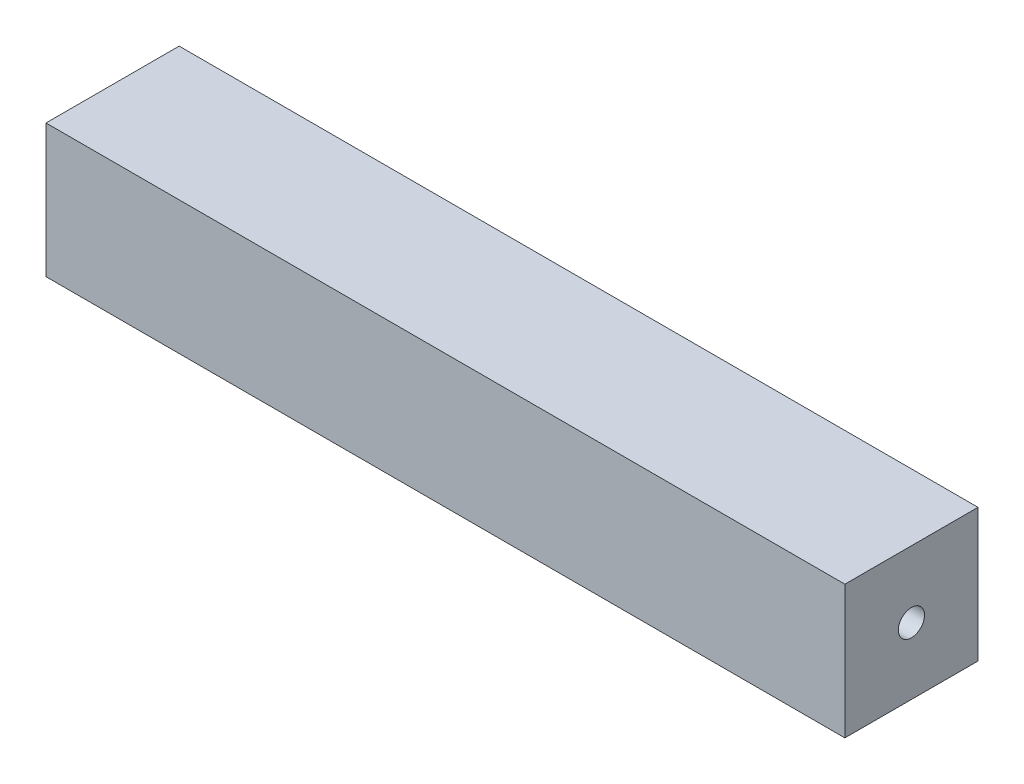
ISO-10303-21;
HEADER;
FILE_DESCRIPTION(('STEP AP214'),'2;1');
FILE_NAME('part.step','',(''),(''),'','','');
FILE_SCHEMA(('AUTOMOTIVE_DESIGN { 1 0 10303 214 1 1 1 1 }'));
ENDSEC;
DATA;
#1=APPLICATION_CONTEXT('core data for automotive mechanical design processes');
#2=APPLICATION_PROTOCOL_DEFINITION('international standard','automotive_design',2000,#1);
#3=PRODUCT_CONTEXT('',#1,'mechanical');
#4=PRODUCT('Part','Part','',(#3));
#5=PRODUCT_RELATED_PRODUCT_CATEGORY('part','',(#4));
#6=PRODUCT_DEFINITION_FORMATION('','',#4);
#7=PRODUCT_DEFINITION_CONTEXT('part definition',#1,'design');
#8=PRODUCT_DEFINITION('design','',#6,#7);
#9=PRODUCT_DEFINITION_SHAPE('','',#8);
#10=(LENGTH_UNIT() NAMED_UNIT(*) SI_UNIT(.MILLI.,.METRE.));
#11=(NAMED_UNIT(*) PLANE_ANGLE_UNIT() SI_UNIT($,.RADIAN.));
#12=(NAMED_UNIT(*) SI_UNIT($,.STERADIAN.) SOLID_ANGLE_UNIT());
#13=UNCERTAINTY_MEASURE_WITH_UNIT(LENGTH_MEASURE(1.E-05),#10,'distance_accuracy_value','');
#14=(GEOMETRIC_REPRESENTATION_CONTEXT(3) GLOBAL_UNCERTAINTY_ASSIGNED_CONTEXT((#13)) GLOBAL_UNIT_ASSIGNED_CONTEXT((#10,
#11,#12)) REPRESENTATION_CONTEXT('',''));
#15=CARTESIAN_POINT('',(0.,0.,0.));
#16=DIRECTION('',(0.,0.,1.));
#17=DIRECTION('',(1.,0.,0.));
#18=AXIS2_PLACEMENT_3D('',#15,#16,#17);
#19=CARTESIAN_POINT('',(0.,12.7,0.));
#20=DIRECTION('',(1.,0.,0.));
#21=DIRECTION('',(0.,0.,-1.));
#22=AXIS2_PLACEMENT_3D('',#19,#20,#21);
#23=PLANE('',#22);
#24=CARTESIAN_POINT('',(0.,6.35,-6.35));
#25=DIRECTION('',(-1.,0.,0.));
#26=DIRECTION('',(0.,0.,1.));
#27=AXIS2_PLACEMENT_3D('',#24,#25,#26);
#28=CIRCLE('',#27,1.25);
#29=CARTESIAN_POINT('',(0.,6.35,-5.1));
#30=VERTEX_POINT('',#29);
#31=EDGE_CURVE('E114',#30,#30,#28,.T.);
#32=ORIENTED_EDGE('',*,*,#31,.F.);
#33=EDGE_LOOP('',(#32));
#34=FACE_BOUND('',#33,.T.);
#35=DIRECTION('',(0.,0.,1.));
#36=VECTOR('',#35,1.);
#37=CARTESIAN_POINT('',(0.,0.,0.));
#38=LINE('',#37,#36);
#39=CARTESIAN_POINT('',(0.,0.,-12.7));
#40=VERTEX_POINT('',#39);
#41=CARTESIAN_POINT('',(0.,0.,0.));
#42=VERTEX_POINT('',#41);
#43=EDGE_CURVE('E100',#40,#42,#38,.T.);
#44=ORIENTED_EDGE('',*,*,#43,.T.);
#45=DIRECTION('',(0.,-1.,0.));
#46=VECTOR('',#45,1.);
#47=CARTESIAN_POINT('',(0.,12.7,0.));
#48=LINE('',#47,#46);
#49=CARTESIAN_POINT('',(0.,12.7,0.));
#50=VERTEX_POINT('',#49);
#51=EDGE_CURVE('E11',#50,#42,#48,.T.);
#52=ORIENTED_EDGE('',*,*,#51,.F.);
#53=DIRECTION('',(0.,0.,1.));
#54=VECTOR('',#53,1.);
#55=CARTESIAN_POINT('',(0.,12.7,0.));
#56=LINE('',#55,#54);
#57=CARTESIAN_POINT('',(0.,12.7,-12.7));
#58=VERTEX_POINT('',#57);
#59=EDGE_CURVE('E88',#58,#50,#56,.T.);
#60=ORIENTED_EDGE('',*,*,#59,.F.);
#61=DIRECTION('',(0.,-1.,0.));
#62=VECTOR('',#61,1.);
#63=CARTESIAN_POINT('',(0.,12.7,-12.7));
#64=LINE('',#63,#62);
#65=EDGE_CURVE('E96',#58,#40,#64,.T.);
#66=ORIENTED_EDGE('',*,*,#65,.T.);
#67=EDGE_LOOP('',(#44,#52,#60,#66));
#68=FACE_BOUND('',#67,.T.);
#69=ADVANCED_FACE('F37',(#34,#68),#23,.F.);
#70=CARTESIAN_POINT('',(0.,12.7,0.));
#71=DIRECTION('',(0.,0.,-1.));
#72=DIRECTION('',(-1.,0.,0.));
#73=AXIS2_PLACEMENT_3D('',#70,#71,#72);
#74=PLANE('',#73);
#75=DIRECTION('',(1.,0.,0.));
#76=VECTOR('',#75,1.);
#77=CARTESIAN_POINT('',(0.,0.,0.));
#78=LINE('',#77,#76);
#79=CARTESIAN_POINT('',(76.2,0.,0.));
#80=VERTEX_POINT('',#79);
#81=EDGE_CURVE('E92',#42,#80,#78,.T.);
#82=ORIENTED_EDGE('',*,*,#81,.T.);
#83=DIRECTION('',(0.,-1.,0.));
#84=VECTOR('',#83,1.);
#85=CARTESIAN_POINT('',(76.2,12.7,0.));
#86=LINE('',#85,#84);
#87=CARTESIAN_POINT('',(76.2,12.7,0.));
#88=VERTEX_POINT('',#87);
#89=EDGE_CURVE('E45',#88,#80,#86,.T.);
#90=ORIENTED_EDGE('',*,*,#89,.F.);
#91=DIRECTION('',(1.,0.,0.));
#92=VECTOR('',#91,1.);
#93=CARTESIAN_POINT('',(0.,12.7,0.));
#94=LINE('',#93,#92);
#95=EDGE_CURVE('E83',#50,#88,#94,.T.);
#96=ORIENTED_EDGE('',*,*,#95,.F.);
#97=ORIENTED_EDGE('',*,*,#51,.T.);
#98=EDGE_LOOP('',(#82,#90,#96,#97));
#99=FACE_BOUND('',#98,.T.);
#100=ADVANCED_FACE('F91',(#99),#74,.F.);
#101=CARTESIAN_POINT('',(76.2,12.7,0.));
#102=DIRECTION('',(-1.,0.,0.));
#103=DIRECTION('',(0.,0.,1.));
#104=AXIS2_PLACEMENT_3D('',#101,#102,#103);
#105=PLANE('',#104);
#106=CARTESIAN_POINT('',(76.2,6.35,-6.35));
#107=DIRECTION('',(1.,0.,0.));
#108=DIRECTION('',(0.,0.,-1.));
#109=AXIS2_PLACEMENT_3D('',#106,#107,#108);
#110=CIRCLE('',#109,1.25);
#111=CARTESIAN_POINT('',(76.2,6.35,-7.6));
#112=VERTEX_POINT('',#111);
#113=EDGE_CURVE('E120',#112,#112,#110,.T.);
#114=ORIENTED_EDGE('',*,*,#113,.F.);
#115=EDGE_LOOP('',(#114));
#116=FACE_BOUND('',#115,.T.);
#117=DIRECTION('',(0.,0.,-1.));
#118=VECTOR('',#117,1.);
#119=CARTESIAN_POINT('',(76.2,0.,0.));
#120=LINE('',#119,#118);
#121=CARTESIAN_POINT('',(76.2,0.,-12.7));
#122=VERTEX_POINT('',#121);
#123=EDGE_CURVE('E70',#80,#122,#120,.T.);
#124=ORIENTED_EDGE('',*,*,#123,.T.);
#125=DIRECTION('',(0.,-1.,0.));
#126=VECTOR('',#125,1.);
#127=CARTESIAN_POINT('',(76.2,12.7,-12.7));
#128=LINE('',#127,#126);
#129=CARTESIAN_POINT('',(76.2,12.7,-12.7));
#130=VERTEX_POINT('',#129);
#131=EDGE_CURVE('E93',#130,#122,#128,.T.);
#132=ORIENTED_EDGE('',*,*,#131,.F.);
#133=DIRECTION('',(0.,0.,-1.));
#134=VECTOR('',#133,1.);
#135=CARTESIAN_POINT('',(76.2,12.7,0.));
#136=LINE('',#135,#134);
#137=EDGE_CURVE('E86',#88,#130,#136,.T.);
#138=ORIENTED_EDGE('',*,*,#137,.F.);
#139=ORIENTED_EDGE('',*,*,#89,.T.);
#140=EDGE_LOOP('',(#124,#132,#138,#139));
#141=FACE_BOUND('',#140,.T.);
#142=ADVANCED_FACE('F94',(#116,#141),#105,.F.);
#143=CARTESIAN_POINT('',(0.,12.7,-12.7));
#144=DIRECTION('',(0.,0.,1.));
#145=DIRECTION('',(1.,0.,0.));
#146=AXIS2_PLACEMENT_3D('',#143,#144,#145);
#147=PLANE('',#146);
#148=DIRECTION('',(-1.,0.,0.));
#149=VECTOR('',#148,1.);
#150=CARTESIAN_POINT('',(0.,0.,-12.7));
#151=LINE('',#150,#149);
#152=EDGE_CURVE('E76',#122,#40,#151,.T.);
#153=ORIENTED_EDGE('',*,*,#152,.T.);
#154=ORIENTED_EDGE('',*,*,#65,.F.);
#155=DIRECTION('',(-1.,0.,0.));
#156=VECTOR('',#155,1.);
#157=CARTESIAN_POINT('',(0.,12.7,-12.7));
#158=LINE('',#157,#156);
#159=EDGE_CURVE('E53',#130,#58,#158,.T.);
#160=ORIENTED_EDGE('',*,*,#159,.F.);
#161=ORIENTED_EDGE('',*,*,#131,.T.);
#162=EDGE_LOOP('',(#153,#154,#160,#161));
#163=FACE_BOUND('',#162,.T.);
#164=ADVANCED_FACE('F108',(#163),#147,.F.);
#165=CARTESIAN_POINT('',(0.,12.7,0.));
#166=DIRECTION('',(0.,-1.,0.));
#167=DIRECTION('',(0.,0.,-1.));
#168=AXIS2_PLACEMENT_3D('',#165,#166,#167);
#169=PLANE('',#168);
#170=ORIENTED_EDGE('',*,*,#59,.T.);
#171=ORIENTED_EDGE('',*,*,#95,.T.);
#172=ORIENTED_EDGE('',*,*,#137,.T.);
#173=ORIENTED_EDGE('',*,*,#159,.T.);
#174=EDGE_LOOP('',(#170,#171,#172,#173));
#175=FACE_BOUND('',#174,.T.);
#176=ADVANCED_FACE('F84',(#175),#169,.F.);
#177=CARTESIAN_POINT('',(0.,0.,0.));
#178=DIRECTION('',(0.,-1.,0.));
#179=DIRECTION('',(0.,0.,-1.));
#180=AXIS2_PLACEMENT_3D('',#177,#178,#179);
#181=PLANE('',#180);
#182=ORIENTED_EDGE('',*,*,#43,.F.);
#183=ORIENTED_EDGE('',*,*,#152,.F.);
#184=ORIENTED_EDGE('',*,*,#123,.F.);
#185=ORIENTED_EDGE('',*,*,#81,.F.);
#186=EDGE_LOOP('',(#182,#183,#184,#185));
#187=FACE_BOUND('',#186,.T.);
#188=ADVANCED_FACE('F111',(#187),#181,.T.);
#189=CARTESIAN_POINT('',(15.24,6.35,-6.35));
#190=DIRECTION('',(-1.,0.,0.));
#191=DIRECTION('',(0.,0.,1.));
#192=AXIS2_PLACEMENT_3D('',#189,#190,#191);
#193=CYLINDRICAL_SURFACE('',#192,1.25);
#194=CARTESIAN_POINT('',(15.24,6.35,-6.35));
#195=DIRECTION('',(-1.,0.,0.));
#196=DIRECTION('',(0.,0.,1.));
#197=AXIS2_PLACEMENT_3D('',#194,#195,#196);
#198=CIRCLE('',#197,1.25);
#199=CARTESIAN_POINT('',(15.24,6.35,-5.1));
#200=VERTEX_POINT('',#199);
#201=EDGE_CURVE('E103',#200,#200,#198,.T.);
#202=ORIENTED_EDGE('',*,*,#201,.F.);
#203=EDGE_LOOP('',(#202));
#204=FACE_BOUND('',#203,.T.);
#205=ORIENTED_EDGE('',*,*,#31,.T.);
#206=EDGE_LOOP('',(#205));
#207=FACE_BOUND('',#206,.T.);
#208=ADVANCED_FACE('F148',(#204,#207),#193,.F.);
#209=CARTESIAN_POINT('',(15.24,6.35,-6.35));
#210=DIRECTION('',(-1.,0.,0.));
#211=DIRECTION('',(0.,0.,1.));
#212=AXIS2_PLACEMENT_3D('',#209,#210,#211);
#213=PLANE('',#212);
#214=ORIENTED_EDGE('',*,*,#201,.T.);
#215=EDGE_LOOP('',(#214));
#216=FACE_BOUND('',#215,.T.);
#217=ADVANCED_FACE('F131',(#216),#213,.T.);
#218=CARTESIAN_POINT('',(60.96,6.35,-6.35));
#219=DIRECTION('',(1.,0.,0.));
#220=DIRECTION('',(0.,0.,-1.));
#221=AXIS2_PLACEMENT_3D('',#218,#219,#220);
#222=CYLINDRICAL_SURFACE('',#221,1.25);
#223=CARTESIAN_POINT('',(60.96,6.35,-6.35));
#224=DIRECTION('',(1.,0.,0.));
#225=DIRECTION('',(0.,0.,-1.));
#226=AXIS2_PLACEMENT_3D('',#223,#224,#225);
#227=CIRCLE('',#226,1.25);
#228=CARTESIAN_POINT('',(60.96,6.35,-7.6));
#229=VERTEX_POINT('',#228);
#230=EDGE_CURVE('E117',#229,#229,#227,.T.);
#231=ORIENTED_EDGE('',*,*,#230,.F.);
#232=EDGE_LOOP('',(#231));
#233=FACE_BOUND('',#232,.T.);
#234=ORIENTED_EDGE('',*,*,#113,.T.);
#235=EDGE_LOOP('',(#234));
#236=FACE_BOUND('',#235,.T.);
#237=ADVANCED_FACE('F128',(#233,#236),#222,.F.);
#238=CARTESIAN_POINT('',(60.96,6.35,-6.35));
#239=DIRECTION('',(1.,0.,0.));
#240=DIRECTION('',(0.,0.,-1.));
#241=AXIS2_PLACEMENT_3D('',#238,#239,#240);
#242=PLANE('',#241);
#243=ORIENTED_EDGE('',*,*,#230,.T.);
#244=EDGE_LOOP('',(#243));
#245=FACE_BOUND('',#244,.T.);
#246=ADVANCED_FACE('F126',(#245),#242,.T.);
#247=CLOSED_SHELL('',(#69,#100,#142,#164,#176,#188,#208,#217,#237,#246));
#248=MANIFOLD_SOLID_BREP('B2',#247);
#249=ADVANCED_BREP_SHAPE_REPRESENTATION('',(#18,#248),#14);
#250=SHAPE_DEFINITION_REPRESENTATION(#9,#249);
ENDSEC;
END-ISO-10303-21;
